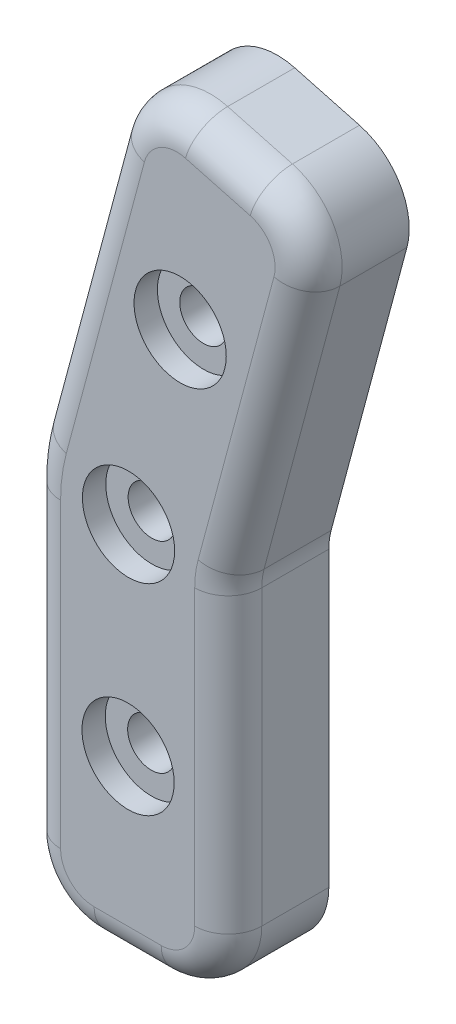
ISO-10303-21;
HEADER;
FILE_DESCRIPTION(('STEP AP214'),'2;1');
FILE_NAME('part.step','',(''),(''),'','','');
FILE_SCHEMA(('AUTOMOTIVE_DESIGN { 1 0 10303 214 1 1 1 1 }'));
ENDSEC;
DATA;
#1=APPLICATION_CONTEXT('core data for automotive mechanical design processes');
#2=APPLICATION_PROTOCOL_DEFINITION('international standard','automotive_design',2000,#1);
#3=PRODUCT_CONTEXT('',#1,'mechanical');
#4=PRODUCT('Part','Part','',(#3));
#5=PRODUCT_RELATED_PRODUCT_CATEGORY('part','',(#4));
#6=PRODUCT_DEFINITION_FORMATION('','',#4);
#7=PRODUCT_DEFINITION_CONTEXT('part definition',#1,'design');
#8=PRODUCT_DEFINITION('design','',#6,#7);
#9=PRODUCT_DEFINITION_SHAPE('','',#8);
#10=(LENGTH_UNIT() NAMED_UNIT(*) SI_UNIT(.MILLI.,.METRE.));
#11=(NAMED_UNIT(*) PLANE_ANGLE_UNIT() SI_UNIT($,.RADIAN.));
#12=(NAMED_UNIT(*) SI_UNIT($,.STERADIAN.) SOLID_ANGLE_UNIT());
#13=UNCERTAINTY_MEASURE_WITH_UNIT(LENGTH_MEASURE(1.E-05),#10,'distance_accuracy_value','');
#14=(GEOMETRIC_REPRESENTATION_CONTEXT(3) GLOBAL_UNCERTAINTY_ASSIGNED_CONTEXT((#13)) GLOBAL_UNIT_ASSIGNED_CONTEXT((#10,
#11,#12)) REPRESENTATION_CONTEXT('',''));
#15=CARTESIAN_POINT('',(0.,0.,0.));
#16=DIRECTION('',(0.,0.,1.));
#17=DIRECTION('',(1.,0.,0.));
#18=AXIS2_PLACEMENT_3D('',#15,#16,#17);
#19=CARTESIAN_POINT('',(0.0385677287744967,-0.344238019104013,4.7625));
#20=DIRECTION('',(0.,0.,1.));
#21=DIRECTION('',(1.,0.,0.));
#22=AXIS2_PLACEMENT_3D('',#19,#20,#21);
#23=CYLINDRICAL_SURFACE('',#22,2.2479);
#24=CARTESIAN_POINT('',(0.0385677287744967,-0.344238019104013,2.5527));
#25=DIRECTION('',(0.,0.,1.));
#26=DIRECTION('',(1.,0.,0.));
#27=AXIS2_PLACEMENT_3D('',#24,#25,#26);
#28=CIRCLE('',#27,2.2479);
#29=CARTESIAN_POINT('',(2.2864677287745,-0.344238019104013,2.5527));
#30=VERTEX_POINT('',#29);
#31=EDGE_CURVE('E364',#30,#30,#28,.T.);
#32=ORIENTED_EDGE('',*,*,#31,.T.);
#33=EDGE_LOOP('',(#32));
#34=FACE_BOUND('',#33,.T.);
#35=CARTESIAN_POINT('',(0.0385677287744967,-0.344238019104013,-1.5875));
#36=DIRECTION('',(0.,0.,-1.));
#37=DIRECTION('',(-1.,0.,0.));
#38=AXIS2_PLACEMENT_3D('',#35,#36,#37);
#39=CIRCLE('',#38,2.2479);
#40=CARTESIAN_POINT('',(-2.2093322712255,-0.344238019104013,-1.5875));
#41=VERTEX_POINT('',#40);
#42=EDGE_CURVE('E310',#41,#41,#39,.T.);
#43=ORIENTED_EDGE('',*,*,#42,.T.);
#44=EDGE_LOOP('',(#43));
#45=FACE_BOUND('',#44,.T.);
#46=ADVANCED_FACE('F37',(#34,#45),#23,.F.);
#47=CARTESIAN_POINT('',(4.97052059182165,37.1177107462453,4.7625));
#48=DIRECTION('',(0.,0.,1.));
#49=DIRECTION('',(1.,0.,0.));
#50=AXIS2_PLACEMENT_3D('',#47,#48,#49);
#51=CYLINDRICAL_SURFACE('',#50,2.2479);
#52=CARTESIAN_POINT('',(4.97052059182165,37.1177107462453,2.5527));
#53=DIRECTION('',(0.,0.,1.));
#54=DIRECTION('',(1.,0.,0.));
#55=AXIS2_PLACEMENT_3D('',#52,#53,#54);
#56=CIRCLE('',#55,2.2479);
#57=CARTESIAN_POINT('',(7.21842059182165,37.1177107462453,2.5527));
#58=VERTEX_POINT('',#57);
#59=EDGE_CURVE('E355',#58,#58,#56,.T.);
#60=ORIENTED_EDGE('',*,*,#59,.T.);
#61=EDGE_LOOP('',(#60));
#62=FACE_BOUND('',#61,.T.);
#63=CARTESIAN_POINT('',(4.97052059182165,37.1177107462453,-1.5875));
#64=DIRECTION('',(0.,0.,-1.));
#65=DIRECTION('',(-1.,0.,0.));
#66=AXIS2_PLACEMENT_3D('',#63,#64,#65);
#67=CIRCLE('',#66,2.2479);
#68=CARTESIAN_POINT('',(2.72262059182165,37.1177107462453,-1.5875));
#69=VERTEX_POINT('',#68);
#70=EDGE_CURVE('E328',#69,#69,#67,.T.);
#71=ORIENTED_EDGE('',*,*,#70,.T.);
#72=EDGE_LOOP('',(#71));
#73=FACE_BOUND('',#72,.T.);
#74=ADVANCED_FACE('F479',(#62,#73),#51,.F.);
#75=CARTESIAN_POINT('',(0.0814876954144572,18.705761980896,4.7625));
#76=DIRECTION('',(0.,0.,1.));
#77=DIRECTION('',(1.,0.,0.));
#78=AXIS2_PLACEMENT_3D('',#75,#76,#77);
#79=CYLINDRICAL_SURFACE('',#78,2.2479);
#80=CARTESIAN_POINT('',(0.0814876954144572,18.705761980896,2.5527));
#81=DIRECTION('',(0.,0.,1.));
#82=DIRECTION('',(1.,0.,0.));
#83=AXIS2_PLACEMENT_3D('',#80,#81,#82);
#84=CIRCLE('',#83,2.2479);
#85=CARTESIAN_POINT('',(2.32938769541446,18.705761980896,2.5527));
#86=VERTEX_POINT('',#85);
#87=EDGE_CURVE('E346',#86,#86,#84,.T.);
#88=ORIENTED_EDGE('',*,*,#87,.T.);
#89=EDGE_LOOP('',(#88));
#90=FACE_BOUND('',#89,.T.);
#91=CARTESIAN_POINT('',(0.0814876954144572,18.705761980896,-1.5875));
#92=DIRECTION('',(0.,0.,-1.));
#93=DIRECTION('',(-1.,0.,0.));
#94=AXIS2_PLACEMENT_3D('',#91,#92,#93);
#95=CIRCLE('',#94,2.2479);
#96=CARTESIAN_POINT('',(-2.16641230458554,18.705761980896,-1.5875));
#97=VERTEX_POINT('',#96);
#98=EDGE_CURVE('E330',#97,#97,#95,.T.);
#99=ORIENTED_EDGE('',*,*,#98,.T.);
#100=EDGE_LOOP('',(#99));
#101=FACE_BOUND('',#100,.T.);
#102=ADVANCED_FACE('F485',(#90,#101),#79,.F.);
#103=CARTESIAN_POINT('',(9.525,-17.4625,4.7625));
#104=DIRECTION('',(-1.,0.,0.));
#105=DIRECTION('',(0.,0.,1.));
#106=AXIS2_PLACEMENT_3D('',#103,#104,#105);
#107=PLANE('',#106);
#108=DIRECTION('',(0.,0.,-1.));
#109=VECTOR('',#108,1.);
#110=CARTESIAN_POINT('',(9.525,16.62650664032,4.7625));
#111=LINE('',#110,#109);
#112=CARTESIAN_POINT('',(9.525,16.62650664032,-4.7625));
#113=VERTEX_POINT('',#112);
#114=CARTESIAN_POINT('',(9.525,16.62650664032,1.5875));
#115=VERTEX_POINT('',#114);
#116=EDGE_CURVE('E206',#113,#115,#111,.F.);
#117=ORIENTED_EDGE('',*,*,#116,.T.);
#118=DIRECTION('',(0.,1.,0.));
#119=VECTOR('',#118,1.);
#120=CARTESIAN_POINT('',(9.525,-17.4625,1.5875));
#121=LINE('',#120,#119);
#122=CARTESIAN_POINT('',(9.525,-11.1125,1.5875));
#123=VERTEX_POINT('',#122);
#124=EDGE_CURVE('E260',#115,#123,#121,.F.);
#125=ORIENTED_EDGE('',*,*,#124,.T.);
#126=DIRECTION('',(0.,0.,-1.));
#127=VECTOR('',#126,1.);
#128=CARTESIAN_POINT('',(9.525,-11.1125,4.7625));
#129=LINE('',#128,#127);
#130=CARTESIAN_POINT('',(9.525,-11.1125,-4.7625));
#131=VERTEX_POINT('',#130);
#132=EDGE_CURVE('E204',#123,#131,#129,.T.);
#133=ORIENTED_EDGE('',*,*,#132,.T.);
#134=DIRECTION('',(0.,1.,0.));
#135=VECTOR('',#134,1.);
#136=CARTESIAN_POINT('',(9.525,-17.4625,-4.7625));
#137=LINE('',#136,#135);
#138=EDGE_CURVE('E184',#131,#113,#137,.T.);
#139=ORIENTED_EDGE('',*,*,#138,.T.);
#140=EDGE_LOOP('',(#117,#125,#133,#139));
#141=FACE_BOUND('',#140,.T.);
#142=ADVANCED_FACE('F415',(#141),#107,.F.);
#143=CARTESIAN_POINT('',(-9.525,-17.4625,4.7625));
#144=DIRECTION('',(1.,0.,0.));
#145=DIRECTION('',(0.,0.,-1.));
#146=AXIS2_PLACEMENT_3D('',#143,#144,#145);
#147=PLANE('',#146);
#148=DIRECTION('',(0.,0.,-1.));
#149=VECTOR('',#148,1.);
#150=CARTESIAN_POINT('',(-9.525,-11.1125,4.7625));
#151=LINE('',#150,#149);
#152=CARTESIAN_POINT('',(-9.525,-11.1125,-4.7625));
#153=VERTEX_POINT('',#152);
#154=CARTESIAN_POINT('',(-9.525,-11.1125,1.5875));
#155=VERTEX_POINT('',#154);
#156=EDGE_CURVE('E227',#153,#155,#151,.F.);
#157=ORIENTED_EDGE('',*,*,#156,.T.);
#158=DIRECTION('',(0.,-1.,0.));
#159=VECTOR('',#158,1.);
#160=CARTESIAN_POINT('',(-9.525,-17.4625,1.5875));
#161=LINE('',#160,#159);
#162=CARTESIAN_POINT('',(-9.525,17.4625,1.5875));
#163=VERTEX_POINT('',#162);
#164=EDGE_CURVE('E268',#155,#163,#161,.F.);
#165=ORIENTED_EDGE('',*,*,#164,.T.);
#166=DIRECTION('',(0.,0.,-1.));
#167=VECTOR('',#166,1.);
#168=CARTESIAN_POINT('',(-9.525,17.4625,4.7625));
#169=LINE('',#168,#167);
#170=CARTESIAN_POINT('',(-9.525,17.4625,-4.7625));
#171=VERTEX_POINT('',#170);
#172=EDGE_CURVE('E198',#163,#171,#169,.T.);
#173=ORIENTED_EDGE('',*,*,#172,.T.);
#174=DIRECTION('',(0.,-1.,0.));
#175=VECTOR('',#174,1.);
#176=CARTESIAN_POINT('',(-9.525,-17.4625,-4.7625));
#177=LINE('',#176,#175);
#178=EDGE_CURVE('E181',#171,#153,#177,.T.);
#179=ORIENTED_EDGE('',*,*,#178,.T.);
#180=EDGE_LOOP('',(#157,#165,#173,#179));
#181=FACE_BOUND('',#180,.T.);
#182=ADVANCED_FACE('F446',(#181),#147,.F.);
#183=CARTESIAN_POINT('',(-9.525,-17.4625,4.7625));
#184=DIRECTION('',(0.,1.,0.));
#185=DIRECTION('',(0.,0.,1.));
#186=AXIS2_PLACEMENT_3D('',#183,#184,#185);
#187=PLANE('',#186);
#188=DIRECTION('',(0.,0.,-1.));
#189=VECTOR('',#188,1.);
#190=CARTESIAN_POINT('',(3.175,-17.4625,4.7625));
#191=LINE('',#190,#189);
#192=CARTESIAN_POINT('',(3.175,-17.4625,-4.7625));
#193=VERTEX_POINT('',#192);
#194=CARTESIAN_POINT('',(3.175,-17.4625,1.5875));
#195=VERTEX_POINT('',#194);
#196=EDGE_CURVE('E222',#193,#195,#191,.F.);
#197=ORIENTED_EDGE('',*,*,#196,.T.);
#198=DIRECTION('',(1.,0.,0.));
#199=VECTOR('',#198,1.);
#200=CARTESIAN_POINT('',(-9.525,-17.4625,1.5875));
#201=LINE('',#200,#199);
#202=CARTESIAN_POINT('',(-3.175,-17.4625,1.5875));
#203=VERTEX_POINT('',#202);
#204=EDGE_CURVE('E264',#195,#203,#201,.F.);
#205=ORIENTED_EDGE('',*,*,#204,.T.);
#206=DIRECTION('',(0.,0.,-1.));
#207=VECTOR('',#206,1.);
#208=CARTESIAN_POINT('',(-3.175,-17.4625,4.7625));
#209=LINE('',#208,#207);
#210=CARTESIAN_POINT('',(-3.175,-17.4625,-4.7625));
#211=VERTEX_POINT('',#210);
#212=EDGE_CURVE('E225',#203,#211,#209,.T.);
#213=ORIENTED_EDGE('',*,*,#212,.T.);
#214=DIRECTION('',(1.,0.,0.));
#215=VECTOR('',#214,1.);
#216=CARTESIAN_POINT('',(-9.525,-17.4625,-4.7625));
#217=LINE('',#216,#215);
#218=EDGE_CURVE('E195',#211,#193,#217,.T.);
#219=ORIENTED_EDGE('',*,*,#218,.T.);
#220=EDGE_LOOP('',(#197,#205,#213,#219));
#221=FACE_BOUND('',#220,.T.);
#222=ADVANCED_FACE('F433',(#221),#187,.F.);
#223=CARTESIAN_POINT('',(0.,0.,4.7625));
#224=DIRECTION('',(0.,0.,-1.));
#225=DIRECTION('',(-1.,0.,0.));
#226=AXIS2_PLACEMENT_3D('',#223,#224,#225);
#227=PLANE('',#226);
#228=DIRECTION('',(0.,1.,0.));
#229=VECTOR('',#228,1.);
#230=CARTESIAN_POINT('',(6.35,0.,4.7625));
#231=LINE('',#230,#229);
#232=CARTESIAN_POINT('',(6.35,-11.1125,4.7625));
#233=VERTEX_POINT('',#232);
#234=CARTESIAN_POINT('',(6.35,16.62650664032,4.7625));
#235=VERTEX_POINT('',#234);
#236=EDGE_CURVE('E252',#233,#235,#231,.T.);
#237=ORIENTED_EDGE('',*,*,#236,.T.);
#238=CARTESIAN_POINT('',(15.875,16.62650664032,4.7625));
#239=DIRECTION('',(0.,0.,-1.));
#240=DIRECTION('',(-1.,0.,0.));
#241=AXIS2_PLACEMENT_3D('',#238,#239,#240);
#242=CIRCLE('',#241,9.525);
#243=CARTESIAN_POINT('',(6.67455650459663,19.0917580449215,4.7625));
#244=VERTEX_POINT('',#243);
#245=EDGE_CURVE('E254',#235,#244,#242,.T.);
#246=ORIENTED_EDGE('',*,*,#245,.T.);
#247=DIRECTION('',(0.258819045102521,0.965925826289068,0.));
#248=VECTOR('',#247,1.);
#249=CARTESIAN_POINT('',(13.8539397153368,45.8855809544106,4.7625));
#250=LINE('',#249,#248);
#251=CARTESIAN_POINT('',(13.8539397153368,45.8855809544106,4.7625));
#252=VERTEX_POINT('',#251);
#253=EDGE_CURVE('E232',#244,#252,#250,.T.);
#254=ORIENTED_EDGE('',*,*,#253,.T.);
#255=CARTESIAN_POINT('',(10.787125216869,46.7073314226111,4.7625));
#256=DIRECTION('',(0.,0.,-1.));
#257=DIRECTION('',(-1.,0.,0.));
#258=AXIS2_PLACEMENT_3D('',#255,#256,#257);
#259=CIRCLE('',#258,3.175);
#260=CARTESIAN_POINT('',(11.6088756850695,49.7741459210789,4.7625));
#261=VERTEX_POINT('',#260);
#262=EDGE_CURVE('E234',#252,#261,#259,.F.);
#263=ORIENTED_EDGE('',*,*,#262,.T.);
#264=DIRECTION('',(-0.965925826289068,0.258819045102521,0.));
#265=VECTOR('',#264,1.);
#266=CARTESIAN_POINT('',(5.47524668813389,51.4176468574799,4.7625));
#267=LINE('',#266,#265);
#268=CARTESIAN_POINT('',(5.47524668813388,51.4176468574799,4.7625));
#269=VERTEX_POINT('',#268);
#270=EDGE_CURVE('E236',#261,#269,#267,.T.);
#271=ORIENTED_EDGE('',*,*,#270,.T.);
#272=CARTESIAN_POINT('',(4.65349621993338,48.3508323590122,4.7625));
#273=DIRECTION('',(0.,0.,-1.));
#274=DIRECTION('',(-1.,0.,0.));
#275=AXIS2_PLACEMENT_3D('',#272,#273,#274);
#276=CIRCLE('',#275,3.175);
#277=CARTESIAN_POINT('',(1.58668172146559,49.1725828272127,4.7625));
#278=VERTEX_POINT('',#277);
#279=EDGE_CURVE('E238',#269,#278,#276,.F.);
#280=ORIENTED_EDGE('',*,*,#279,.T.);
#281=DIRECTION('',(-0.258819045102521,-0.965925826289068,0.));
#282=VECTOR('',#281,1.);
#283=CARTESIAN_POINT('',(-5.80907249233896,21.5712523410025,4.7625));
#284=LINE('',#283,#282);
#285=CARTESIAN_POINT('',(-5.80907249233896,21.5712523410025,4.7625));
#286=VERTEX_POINT('',#285);
#287=EDGE_CURVE('E240',#278,#286,#284,.T.);
#288=ORIENTED_EDGE('',*,*,#287,.T.);
#289=CARTESIAN_POINT('',(9.525,17.4625,4.7625));
#290=DIRECTION('',(0.,0.,-1.));
#291=DIRECTION('',(-1.,0.,0.));
#292=AXIS2_PLACEMENT_3D('',#289,#290,#291);
#293=CIRCLE('',#292,15.875);
#294=CARTESIAN_POINT('',(-6.35,17.4625,4.7625));
#295=VERTEX_POINT('',#294);
#296=EDGE_CURVE('E242',#286,#295,#293,.F.);
#297=ORIENTED_EDGE('',*,*,#296,.T.);
#298=DIRECTION('',(0.,-1.,0.));
#299=VECTOR('',#298,1.);
#300=CARTESIAN_POINT('',(-6.35,0.,4.7625));
#301=LINE('',#300,#299);
#302=CARTESIAN_POINT('',(-6.35,-11.1125,4.7625));
#303=VERTEX_POINT('',#302);
#304=EDGE_CURVE('E244',#295,#303,#301,.T.);
#305=ORIENTED_EDGE('',*,*,#304,.T.);
#306=CARTESIAN_POINT('',(-3.175,-11.1125,4.7625));
#307=DIRECTION('',(0.,0.,-1.));
#308=DIRECTION('',(-1.,0.,0.));
#309=AXIS2_PLACEMENT_3D('',#306,#307,#308);
#310=CIRCLE('',#309,3.175);
#311=CARTESIAN_POINT('',(-3.175,-14.2875,4.7625));
#312=VERTEX_POINT('',#311);
#313=EDGE_CURVE('E246',#303,#312,#310,.F.);
#314=ORIENTED_EDGE('',*,*,#313,.T.);
#315=DIRECTION('',(1.,0.,0.));
#316=VECTOR('',#315,1.);
#317=CARTESIAN_POINT('',(0.,-14.2875,4.7625));
#318=LINE('',#317,#316);
#319=CARTESIAN_POINT('',(3.175,-14.2875,4.7625));
#320=VERTEX_POINT('',#319);
#321=EDGE_CURVE('E248',#312,#320,#318,.T.);
#322=ORIENTED_EDGE('',*,*,#321,.T.);
#323=CARTESIAN_POINT('',(3.175,-11.1125,4.7625));
#324=DIRECTION('',(0.,0.,-1.));
#325=DIRECTION('',(-1.,0.,0.));
#326=AXIS2_PLACEMENT_3D('',#323,#324,#325);
#327=CIRCLE('',#326,3.175);
#328=EDGE_CURVE('E250',#320,#233,#327,.F.);
#329=ORIENTED_EDGE('',*,*,#328,.T.);
#330=EDGE_LOOP('',(#237,#246,#254,#263,#271,#280,#288,#297,#305,#314,#322,#329));
#331=FACE_BOUND('',#330,.T.);
#332=CARTESIAN_POINT('',(0.0814876954144572,18.705761980896,4.7625));
#333=DIRECTION('',(0.,0.,1.));
#334=DIRECTION('',(1.,0.,0.));
#335=AXIS2_PLACEMENT_3D('',#332,#333,#334);
#336=CIRCLE('',#335,4.36626);
#337=CARTESIAN_POINT('',(4.44774769541446,18.705761980896,4.7625));
#338=VERTEX_POINT('',#337);
#339=EDGE_CURVE('E338',#338,#338,#336,.T.);
#340=ORIENTED_EDGE('',*,*,#339,.F.);
#341=EDGE_LOOP('',(#340));
#342=FACE_BOUND('',#341,.T.);
#343=CARTESIAN_POINT('',(4.97052059182165,37.1177107462453,4.7625));
#344=DIRECTION('',(0.,0.,1.));
#345=DIRECTION('',(1.,0.,0.));
#346=AXIS2_PLACEMENT_3D('',#343,#344,#345);
#347=CIRCLE('',#346,4.36626);
#348=CARTESIAN_POINT('',(9.33678059182165,37.1177107462453,4.7625));
#349=VERTEX_POINT('',#348);
#350=EDGE_CURVE('E349',#349,#349,#347,.T.);
#351=ORIENTED_EDGE('',*,*,#350,.F.);
#352=EDGE_LOOP('',(#351));
#353=FACE_BOUND('',#352,.T.);
#354=CARTESIAN_POINT('',(0.0385677287744967,-0.344238019104013,4.7625));
#355=DIRECTION('',(0.,0.,1.));
#356=DIRECTION('',(1.,0.,0.));
#357=AXIS2_PLACEMENT_3D('',#354,#355,#356);
#358=CIRCLE('',#357,4.36626);
#359=CARTESIAN_POINT('',(4.4048277287745,-0.344238019104013,4.7625));
#360=VERTEX_POINT('',#359);
#361=EDGE_CURVE('E358',#360,#360,#358,.T.);
#362=ORIENTED_EDGE('',*,*,#361,.F.);
#363=EDGE_LOOP('',(#362));
#364=FACE_BOUND('',#363,.T.);
#365=ADVANCED_FACE('F451',(#331,#342,#353,#364),#227,.F.);
#366=CARTESIAN_POINT('',(0.,0.,-4.7625));
#367=DIRECTION('',(0.,0.,-1.));
#368=DIRECTION('',(-1.,0.,0.));
#369=AXIS2_PLACEMENT_3D('',#366,#367,#368);
#370=PLANE('',#369);
#371=CARTESIAN_POINT('',(0.0385677287744967,-0.344238019104013,-4.7625));
#372=DIRECTION('',(0.,0.,-1.));
#373=DIRECTION('',(-1.,0.,0.));
#374=AXIS2_PLACEMENT_3D('',#371,#372,#373);
#375=CIRCLE('',#374,3.175);
#376=CARTESIAN_POINT('',(-3.1364322712255,-0.344238019104013,-4.7625));
#377=VERTEX_POINT('',#376);
#378=EDGE_CURVE('E316',#377,#377,#375,.T.);
#379=ORIENTED_EDGE('',*,*,#378,.F.);
#380=EDGE_LOOP('',(#379));
#381=FACE_BOUND('',#380,.T.);
#382=CARTESIAN_POINT('',(4.97052059182165,37.1177107462453,-4.7625));
#383=DIRECTION('',(0.,0.,-1.));
#384=DIRECTION('',(-1.,0.,0.));
#385=AXIS2_PLACEMENT_3D('',#382,#383,#384);
#386=CIRCLE('',#385,3.175);
#387=CARTESIAN_POINT('',(1.79552059182165,37.1177107462453,-4.7625));
#388=VERTEX_POINT('',#387);
#389=EDGE_CURVE('E325',#388,#388,#386,.T.);
#390=ORIENTED_EDGE('',*,*,#389,.F.);
#391=EDGE_LOOP('',(#390));
#392=FACE_BOUND('',#391,.T.);
#393=CARTESIAN_POINT('',(0.0814876954144572,18.705761980896,-4.7625));
#394=DIRECTION('',(0.,0.,-1.));
#395=DIRECTION('',(-1.,0.,0.));
#396=AXIS2_PLACEMENT_3D('',#393,#394,#395);
#397=CIRCLE('',#396,3.175);
#398=CARTESIAN_POINT('',(-3.09351230458554,18.705761980896,-4.7625));
#399=VERTEX_POINT('',#398);
#400=EDGE_CURVE('E333',#399,#399,#397,.T.);
#401=ORIENTED_EDGE('',*,*,#400,.F.);
#402=EDGE_LOOP('',(#401));
#403=FACE_BOUND('',#402,.T.);
#404=DIRECTION('',(-0.258819045102521,-0.965925826289068,0.));
#405=VECTOR('',#404,1.);
#406=CARTESIAN_POINT('',(0.163368159398803,56.1279622923487,-4.7625));
#407=LINE('',#406,#405);
#408=CARTESIAN_POINT('',(-1.48013277700221,49.9943332954132,-4.7625));
#409=VERTEX_POINT('',#408);
#410=CARTESIAN_POINT('',(-8.87588699080675,22.393002809203,-4.7625));
#411=VERTEX_POINT('',#410);
#412=EDGE_CURVE('E164',#409,#411,#407,.T.);
#413=ORIENTED_EDGE('',*,*,#412,.F.);
#414=CARTESIAN_POINT('',(4.65349621993338,48.3508323590122,-4.7625));
#415=DIRECTION('',(0.,0.,-1.));
#416=DIRECTION('',(-1.,0.,0.));
#417=AXIS2_PLACEMENT_3D('',#414,#415,#416);
#418=CIRCLE('',#417,6.35);
#419=CARTESIAN_POINT('',(6.29699715633439,54.4844613559477,-4.7625));
#420=VERTEX_POINT('',#419);
#421=EDGE_CURVE('E220',#409,#420,#418,.T.);
#422=ORIENTED_EDGE('',*,*,#421,.T.);
#423=DIRECTION('',(-0.965925826289068,0.258819045102521,0.));
#424=VECTOR('',#423,1.);
#425=CARTESIAN_POINT('',(18.5642551502056,51.1974594831457,-4.7625));
#426=LINE('',#425,#424);
#427=CARTESIAN_POINT('',(12.43062615327,52.8409604195467,-4.7625));
#428=VERTEX_POINT('',#427);
#429=EDGE_CURVE('E174',#428,#420,#426,.T.);
#430=ORIENTED_EDGE('',*,*,#429,.F.);
#431=CARTESIAN_POINT('',(10.787125216869,46.7073314226111,-4.7625));
#432=DIRECTION('',(0.,0.,-1.));
#433=DIRECTION('',(-1.,0.,0.));
#434=AXIS2_PLACEMENT_3D('',#431,#432,#433);
#435=CIRCLE('',#434,6.35);
#436=CARTESIAN_POINT('',(16.9207542138046,45.0638304862101,-4.7625));
#437=VERTEX_POINT('',#436);
#438=EDGE_CURVE('E214',#428,#437,#435,.T.);
#439=ORIENTED_EDGE('',*,*,#438,.T.);
#440=DIRECTION('',(0.258819045102521,0.965925826289068,0.));
#441=VECTOR('',#440,1.);
#442=CARTESIAN_POINT('',(9.525,17.4625,-4.7625));
#443=LINE('',#442,#441);
#444=CARTESIAN_POINT('',(9.74137100306442,18.270007576721,-4.7625));
#445=VERTEX_POINT('',#444);
#446=EDGE_CURVE('E367',#445,#437,#443,.T.);
#447=ORIENTED_EDGE('',*,*,#446,.F.);
#448=CARTESIAN_POINT('',(15.875,16.62650664032,-4.7625));
#449=DIRECTION('',(0.,0.,-1.));
#450=DIRECTION('',(-1.,0.,0.));
#451=AXIS2_PLACEMENT_3D('',#448,#449,#450);
#452=CIRCLE('',#451,6.35);
#453=EDGE_CURVE('E230',#445,#113,#452,.F.);
#454=ORIENTED_EDGE('',*,*,#453,.T.);
#455=ORIENTED_EDGE('',*,*,#138,.F.);
#456=CARTESIAN_POINT('',(3.175,-11.1125,-4.7625));
#457=DIRECTION('',(0.,0.,-1.));
#458=DIRECTION('',(-1.,0.,0.));
#459=AXIS2_PLACEMENT_3D('',#456,#457,#458);
#460=CIRCLE('',#459,6.35);
#461=EDGE_CURVE('E216',#131,#193,#460,.T.);
#462=ORIENTED_EDGE('',*,*,#461,.T.);
#463=ORIENTED_EDGE('',*,*,#218,.F.);
#464=CARTESIAN_POINT('',(-3.175,-11.1125,-4.7625));
#465=DIRECTION('',(0.,0.,-1.));
#466=DIRECTION('',(-1.,0.,0.));
#467=AXIS2_PLACEMENT_3D('',#464,#465,#466);
#468=CIRCLE('',#467,6.35);
#469=EDGE_CURVE('E218',#211,#153,#468,.T.);
#470=ORIENTED_EDGE('',*,*,#469,.T.);
#471=ORIENTED_EDGE('',*,*,#178,.F.);
#472=CARTESIAN_POINT('',(9.525,17.4625,-4.7625));
#473=DIRECTION('',(0.,0.,-1.));
#474=DIRECTION('',(-1.,0.,0.));
#475=AXIS2_PLACEMENT_3D('',#472,#473,#474);
#476=CIRCLE('',#475,19.05);
#477=EDGE_CURVE('E178',#411,#171,#476,.F.);
#478=ORIENTED_EDGE('',*,*,#477,.F.);
#479=EDGE_LOOP('',(#413,#422,#430,#439,#447,#454,#455,#462,#463,#470,#471,#478));
#480=FACE_BOUND('',#479,.T.);
#481=ADVANCED_FACE('F179',(#381,#392,#403,#480),#370,.T.);
#482=CARTESIAN_POINT('',(9.525,17.4625,-24.4402122133534));
#483=DIRECTION('',(0.,0.,1.));
#484=DIRECTION('',(1.,0.,0.));
#485=AXIS2_PLACEMENT_3D('',#482,#483,#484);
#486=CYLINDRICAL_SURFACE('',#485,19.05);
#487=ORIENTED_EDGE('',*,*,#172,.F.);
#488=CARTESIAN_POINT('',(9.525,17.4625,1.5875));
#489=DIRECTION('',(0.,0.,-1.));
#490=DIRECTION('',(-1.,0.,0.));
#491=AXIS2_PLACEMENT_3D('',#488,#489,#490);
#492=CIRCLE('',#491,19.05);
#493=CARTESIAN_POINT('',(-8.87588699080675,22.393002809203,1.5875));
#494=VERTEX_POINT('',#493);
#495=EDGE_CURVE('E188',#163,#494,#492,.T.);
#496=ORIENTED_EDGE('',*,*,#495,.T.);
#497=DIRECTION('',(0.,0.,1.));
#498=VECTOR('',#497,1.);
#499=CARTESIAN_POINT('',(-8.87588699080675,22.393002809203,-24.4402122133534));
#500=LINE('',#499,#498);
#501=EDGE_CURVE('E168',#411,#494,#500,.T.);
#502=ORIENTED_EDGE('',*,*,#501,.F.);
#503=ORIENTED_EDGE('',*,*,#477,.T.);
#504=EDGE_LOOP('',(#487,#496,#502,#503));
#505=FACE_BOUND('',#504,.T.);
#506=ADVANCED_FACE('F186',(#505),#486,.T.);
#507=CARTESIAN_POINT('',(9.525,17.4625,-52.1753608607412));
#508=DIRECTION('',(0.965925826289068,-0.258819045102521,0.));
#509=DIRECTION('',(0.258819045102521,0.965925826289068,0.));
#510=AXIS2_PLACEMENT_3D('',#507,#508,#509);
#511=PLANE('',#510);
#512=DIRECTION('',(0.,0.,1.));
#513=VECTOR('',#512,1.);
#514=CARTESIAN_POINT('',(16.9207542138046,45.0638304862101,-52.1753608607412));
#515=LINE('',#514,#513);
#516=CARTESIAN_POINT('',(16.9207542138046,45.0638304862101,1.5875));
#517=VERTEX_POINT('',#516);
#518=EDGE_CURVE('E200',#437,#517,#515,.T.);
#519=ORIENTED_EDGE('',*,*,#518,.T.);
#520=DIRECTION('',(0.258819045102521,0.965925826289068,0.));
#521=VECTOR('',#520,1.);
#522=CARTESIAN_POINT('',(9.74137100306442,18.270007576721,1.5875));
#523=LINE('',#522,#521);
#524=CARTESIAN_POINT('',(9.74137100306442,18.270007576721,1.5875));
#525=VERTEX_POINT('',#524);
#526=EDGE_CURVE('E11',#517,#525,#523,.F.);
#527=ORIENTED_EDGE('',*,*,#526,.T.);
#528=DIRECTION('',(0.,0.,-1.));
#529=VECTOR('',#528,1.);
#530=CARTESIAN_POINT('',(9.74137100306442,18.270007576721,-52.1753608607412));
#531=LINE('',#530,#529);
#532=EDGE_CURVE('E202',#525,#445,#531,.T.);
#533=ORIENTED_EDGE('',*,*,#532,.T.);
#534=ORIENTED_EDGE('',*,*,#446,.T.);
#535=EDGE_LOOP('',(#519,#527,#533,#534));
#536=FACE_BOUND('',#535,.T.);
#537=ADVANCED_FACE('F397',(#536),#511,.T.);
#538=CARTESIAN_POINT('',(18.5642551502056,51.1974594831457,-52.1753608607412));
#539=DIRECTION('',(0.258819045102521,0.965925826289068,0.));
#540=DIRECTION('',(-0.965925826289068,0.258819045102521,0.));
#541=AXIS2_PLACEMENT_3D('',#538,#539,#540);
#542=PLANE('',#541);
#543=DIRECTION('',(0.,0.,1.));
#544=VECTOR('',#543,1.);
#545=CARTESIAN_POINT('',(6.29699715633439,54.4844613559477,-52.1753608607412));
#546=LINE('',#545,#544);
#547=CARTESIAN_POINT('',(6.29699715633439,54.4844613559477,1.5875));
#548=VERTEX_POINT('',#547);
#549=EDGE_CURVE('E211',#420,#548,#546,.T.);
#550=ORIENTED_EDGE('',*,*,#549,.T.);
#551=DIRECTION('',(-0.965925826289068,0.258819045102521,0.));
#552=VECTOR('',#551,1.);
#553=CARTESIAN_POINT('',(12.43062615327,52.8409604195467,1.5875));
#554=LINE('',#553,#552);
#555=CARTESIAN_POINT('',(12.43062615327,52.8409604195467,1.5875));
#556=VERTEX_POINT('',#555);
#557=EDGE_CURVE('E61',#548,#556,#554,.F.);
#558=ORIENTED_EDGE('',*,*,#557,.T.);
#559=DIRECTION('',(0.,0.,1.));
#560=VECTOR('',#559,1.);
#561=CARTESIAN_POINT('',(12.43062615327,52.8409604195467,-52.1753608607412));
#562=LINE('',#561,#560);
#563=EDGE_CURVE('E209',#556,#428,#562,.F.);
#564=ORIENTED_EDGE('',*,*,#563,.T.);
#565=ORIENTED_EDGE('',*,*,#429,.T.);
#566=EDGE_LOOP('',(#550,#558,#564,#565));
#567=FACE_BOUND('',#566,.T.);
#568=ADVANCED_FACE('F372',(#567),#542,.T.);
#569=CARTESIAN_POINT('',(0.163368159398803,56.1279622923487,-52.1753608607412));
#570=DIRECTION('',(-0.965925826289068,0.258819045102521,0.));
#571=DIRECTION('',(-0.258819045102521,-0.965925826289068,0.));
#572=AXIS2_PLACEMENT_3D('',#569,#570,#571);
#573=PLANE('',#572);
#574=ORIENTED_EDGE('',*,*,#501,.T.);
#575=DIRECTION('',(-0.258819045102521,-0.965925826289068,0.));
#576=VECTOR('',#575,1.);
#577=CARTESIAN_POINT('',(-1.4801327770022,49.9943332954132,1.5875));
#578=LINE('',#577,#576);
#579=CARTESIAN_POINT('',(-1.4801327770022,49.9943332954132,1.5875));
#580=VERTEX_POINT('',#579);
#581=EDGE_CURVE('E271',#494,#580,#578,.F.);
#582=ORIENTED_EDGE('',*,*,#581,.T.);
#583=DIRECTION('',(0.,0.,1.));
#584=VECTOR('',#583,1.);
#585=CARTESIAN_POINT('',(-1.4801327770022,49.9943332954132,-52.1753608607412));
#586=LINE('',#585,#584);
#587=EDGE_CURVE('E171',#580,#409,#586,.F.);
#588=ORIENTED_EDGE('',*,*,#587,.T.);
#589=ORIENTED_EDGE('',*,*,#412,.T.);
#590=EDGE_LOOP('',(#574,#582,#588,#589));
#591=FACE_BOUND('',#590,.T.);
#592=ADVANCED_FACE('F166',(#591),#573,.T.);
#593=CARTESIAN_POINT('',(2.2864677287745,-0.344238019104013,2.5527));
#594=DIRECTION('',(0.,0.,-1.));
#595=DIRECTION('',(-1.,0.,0.));
#596=AXIS2_PLACEMENT_3D('',#593,#594,#595);
#597=PLANE('',#596);
#598=ORIENTED_EDGE('',*,*,#31,.F.);
#599=EDGE_LOOP('',(#598));
#600=FACE_BOUND('',#599,.T.);
#601=CARTESIAN_POINT('',(0.0385677287744967,-0.344238019104013,2.5527));
#602=DIRECTION('',(0.,0.,1.));
#603=DIRECTION('',(1.,0.,0.));
#604=AXIS2_PLACEMENT_3D('',#601,#602,#603);
#605=CIRCLE('',#604,4.36626);
#606=CARTESIAN_POINT('',(4.4048277287745,-0.344238019104013,2.5527));
#607=VERTEX_POINT('',#606);
#608=EDGE_CURVE('E361',#607,#607,#605,.T.);
#609=ORIENTED_EDGE('',*,*,#608,.T.);
#610=EDGE_LOOP('',(#609));
#611=FACE_BOUND('',#610,.T.);
#612=ADVANCED_FACE('F464',(#600,#611),#597,.F.);
#613=CARTESIAN_POINT('',(0.0385677287744967,-0.344238019104013,4.7625));
#614=DIRECTION('',(0.,0.,1.));
#615=DIRECTION('',(1.,0.,0.));
#616=AXIS2_PLACEMENT_3D('',#613,#614,#615);
#617=CYLINDRICAL_SURFACE('',#616,4.36626);
#618=ORIENTED_EDGE('',*,*,#608,.F.);
#619=EDGE_LOOP('',(#618));
#620=FACE_BOUND('',#619,.T.);
#621=ORIENTED_EDGE('',*,*,#361,.T.);
#622=EDGE_LOOP('',(#621));
#623=FACE_BOUND('',#622,.T.);
#624=ADVANCED_FACE('F461',(#620,#623),#617,.F.);
#625=CARTESIAN_POINT('',(7.21842059182165,37.1177107462453,2.5527));
#626=DIRECTION('',(0.,0.,-1.));
#627=DIRECTION('',(-1.,0.,0.));
#628=AXIS2_PLACEMENT_3D('',#625,#626,#627);
#629=PLANE('',#628);
#630=ORIENTED_EDGE('',*,*,#59,.F.);
#631=EDGE_LOOP('',(#630));
#632=FACE_BOUND('',#631,.T.);
#633=CARTESIAN_POINT('',(4.97052059182165,37.1177107462453,2.5527));
#634=DIRECTION('',(0.,0.,1.));
#635=DIRECTION('',(1.,0.,0.));
#636=AXIS2_PLACEMENT_3D('',#633,#634,#635);
#637=CIRCLE('',#636,4.36626);
#638=CARTESIAN_POINT('',(9.33678059182165,37.1177107462453,2.5527));
#639=VERTEX_POINT('',#638);
#640=EDGE_CURVE('E352',#639,#639,#637,.T.);
#641=ORIENTED_EDGE('',*,*,#640,.T.);
#642=EDGE_LOOP('',(#641));
#643=FACE_BOUND('',#642,.T.);
#644=ADVANCED_FACE('F463',(#632,#643),#629,.F.);
#645=CARTESIAN_POINT('',(4.97052059182165,37.1177107462453,4.7625));
#646=DIRECTION('',(0.,0.,1.));
#647=DIRECTION('',(1.,0.,0.));
#648=AXIS2_PLACEMENT_3D('',#645,#646,#647);
#649=CYLINDRICAL_SURFACE('',#648,4.36626);
#650=ORIENTED_EDGE('',*,*,#640,.F.);
#651=EDGE_LOOP('',(#650));
#652=FACE_BOUND('',#651,.T.);
#653=ORIENTED_EDGE('',*,*,#350,.T.);
#654=EDGE_LOOP('',(#653));
#655=FACE_BOUND('',#654,.T.);
#656=ADVANCED_FACE('F471',(#652,#655),#649,.F.);
#657=CARTESIAN_POINT('',(2.32938769541446,18.705761980896,2.5527));
#658=DIRECTION('',(0.,0.,-1.));
#659=DIRECTION('',(-1.,0.,0.));
#660=AXIS2_PLACEMENT_3D('',#657,#658,#659);
#661=PLANE('',#660);
#662=ORIENTED_EDGE('',*,*,#87,.F.);
#663=EDGE_LOOP('',(#662));
#664=FACE_BOUND('',#663,.T.);
#665=CARTESIAN_POINT('',(0.0814876954144572,18.705761980896,2.5527));
#666=DIRECTION('',(0.,0.,1.));
#667=DIRECTION('',(1.,0.,0.));
#668=AXIS2_PLACEMENT_3D('',#665,#666,#667);
#669=CIRCLE('',#668,4.36626);
#670=CARTESIAN_POINT('',(4.44774769541446,18.705761980896,2.5527));
#671=VERTEX_POINT('',#670);
#672=EDGE_CURVE('E343',#671,#671,#669,.T.);
#673=ORIENTED_EDGE('',*,*,#672,.T.);
#674=EDGE_LOOP('',(#673));
#675=FACE_BOUND('',#674,.T.);
#676=ADVANCED_FACE('F568',(#664,#675),#661,.F.);
#677=CARTESIAN_POINT('',(0.0814876954144572,18.705761980896,4.7625));
#678=DIRECTION('',(0.,0.,1.));
#679=DIRECTION('',(1.,0.,0.));
#680=AXIS2_PLACEMENT_3D('',#677,#678,#679);
#681=CYLINDRICAL_SURFACE('',#680,4.36626);
#682=ORIENTED_EDGE('',*,*,#672,.F.);
#683=EDGE_LOOP('',(#682));
#684=FACE_BOUND('',#683,.T.);
#685=ORIENTED_EDGE('',*,*,#339,.T.);
#686=EDGE_LOOP('',(#685));
#687=FACE_BOUND('',#686,.T.);
#688=ADVANCED_FACE('F507',(#684,#687),#681,.F.);
#689=CARTESIAN_POINT('',(15.875,16.62650664032,-52.1753608607412));
#690=DIRECTION('',(0.,0.,-1.));
#691=DIRECTION('',(-1.,0.,0.));
#692=AXIS2_PLACEMENT_3D('',#689,#690,#691);
#693=CYLINDRICAL_SURFACE('',#692,6.35);
#694=ORIENTED_EDGE('',*,*,#532,.F.);
#695=CARTESIAN_POINT('',(15.875,16.62650664032,1.5875));
#696=DIRECTION('',(0.,0.,-1.));
#697=DIRECTION('',(-1.,0.,0.));
#698=AXIS2_PLACEMENT_3D('',#695,#696,#697);
#699=CIRCLE('',#698,6.35);
#700=EDGE_CURVE('E257',#525,#115,#699,.F.);
#701=ORIENTED_EDGE('',*,*,#700,.T.);
#702=ORIENTED_EDGE('',*,*,#116,.F.);
#703=ORIENTED_EDGE('',*,*,#453,.F.);
#704=EDGE_LOOP('',(#694,#701,#702,#703));
#705=FACE_BOUND('',#704,.T.);
#706=ADVANCED_FACE('F401',(#705),#693,.F.);
#707=CARTESIAN_POINT('',(4.65349621993338,48.3508323590122,-52.1753608607412));
#708=DIRECTION('',(0.,0.,1.));
#709=DIRECTION('',(1.,0.,0.));
#710=AXIS2_PLACEMENT_3D('',#707,#708,#709);
#711=CYLINDRICAL_SURFACE('',#710,6.35);
#712=ORIENTED_EDGE('',*,*,#587,.F.);
#713=CARTESIAN_POINT('',(4.65349621993338,48.3508323590122,1.5875));
#714=DIRECTION('',(0.,0.,-1.));
#715=DIRECTION('',(-1.,0.,0.));
#716=AXIS2_PLACEMENT_3D('',#713,#714,#715);
#717=CIRCLE('',#716,6.35);
#718=EDGE_CURVE('E273',#580,#548,#717,.T.);
#719=ORIENTED_EDGE('',*,*,#718,.T.);
#720=ORIENTED_EDGE('',*,*,#549,.F.);
#721=ORIENTED_EDGE('',*,*,#421,.F.);
#722=EDGE_LOOP('',(#712,#719,#720,#721));
#723=FACE_BOUND('',#722,.T.);
#724=ADVANCED_FACE('F376',(#723),#711,.T.);
#725=CARTESIAN_POINT('',(-3.175,-11.1125,4.7625));
#726=DIRECTION('',(0.,0.,-1.));
#727=DIRECTION('',(-1.,0.,0.));
#728=AXIS2_PLACEMENT_3D('',#725,#726,#727);
#729=CYLINDRICAL_SURFACE('',#728,6.35);
#730=ORIENTED_EDGE('',*,*,#212,.F.);
#731=CARTESIAN_POINT('',(-3.175,-11.1125,1.5875));
#732=DIRECTION('',(0.,0.,-1.));
#733=DIRECTION('',(-1.,0.,0.));
#734=AXIS2_PLACEMENT_3D('',#731,#732,#733);
#735=CIRCLE('',#734,6.35);
#736=EDGE_CURVE('E266',#203,#155,#735,.T.);
#737=ORIENTED_EDGE('',*,*,#736,.T.);
#738=ORIENTED_EDGE('',*,*,#156,.F.);
#739=ORIENTED_EDGE('',*,*,#469,.F.);
#740=EDGE_LOOP('',(#730,#737,#738,#739));
#741=FACE_BOUND('',#740,.T.);
#742=ADVANCED_FACE('F437',(#741),#729,.T.);
#743=CARTESIAN_POINT('',(3.175,-11.1125,4.7625));
#744=DIRECTION('',(0.,0.,-1.));
#745=DIRECTION('',(-1.,0.,0.));
#746=AXIS2_PLACEMENT_3D('',#743,#744,#745);
#747=CYLINDRICAL_SURFACE('',#746,6.35);
#748=ORIENTED_EDGE('',*,*,#132,.F.);
#749=CARTESIAN_POINT('',(3.175,-11.1125,1.5875));
#750=DIRECTION('',(0.,0.,-1.));
#751=DIRECTION('',(-1.,0.,0.));
#752=AXIS2_PLACEMENT_3D('',#749,#750,#751);
#753=CIRCLE('',#752,6.35);
#754=EDGE_CURVE('E262',#123,#195,#753,.T.);
#755=ORIENTED_EDGE('',*,*,#754,.T.);
#756=ORIENTED_EDGE('',*,*,#196,.F.);
#757=ORIENTED_EDGE('',*,*,#461,.F.);
#758=EDGE_LOOP('',(#748,#755,#756,#757));
#759=FACE_BOUND('',#758,.T.);
#760=ADVANCED_FACE('F419',(#759),#747,.T.);
#761=CARTESIAN_POINT('',(10.787125216869,46.7073314226111,-52.1753608607412));
#762=DIRECTION('',(0.,0.,1.));
#763=DIRECTION('',(1.,0.,0.));
#764=AXIS2_PLACEMENT_3D('',#761,#762,#763);
#765=CYLINDRICAL_SURFACE('',#764,6.35);
#766=ORIENTED_EDGE('',*,*,#563,.F.);
#767=CARTESIAN_POINT('',(10.787125216869,46.7073314226111,1.5875));
#768=DIRECTION('',(0.,0.,-1.));
#769=DIRECTION('',(-1.,0.,0.));
#770=AXIS2_PLACEMENT_3D('',#767,#768,#769);
#771=CIRCLE('',#770,6.35);
#772=EDGE_CURVE('E46',#556,#517,#771,.T.);
#773=ORIENTED_EDGE('',*,*,#772,.T.);
#774=ORIENTED_EDGE('',*,*,#518,.F.);
#775=ORIENTED_EDGE('',*,*,#438,.F.);
#776=EDGE_LOOP('',(#766,#773,#774,#775));
#777=FACE_BOUND('',#776,.T.);
#778=ADVANCED_FACE('F514',(#777),#765,.T.);
#779=CARTESIAN_POINT('',(0.0814876954144572,18.705761980896,-1.5875));
#780=DIRECTION('',(0.,0.,-1.));
#781=DIRECTION('',(-1.,0.,0.));
#782=AXIS2_PLACEMENT_3D('',#779,#780,#781);
#783=CYLINDRICAL_SURFACE('',#782,3.175);
#784=CARTESIAN_POINT('',(0.0814876954144572,18.705761980896,-1.5875));
#785=DIRECTION('',(0.,0.,-1.));
#786=DIRECTION('',(-1.,0.,0.));
#787=AXIS2_PLACEMENT_3D('',#784,#785,#786);
#788=CIRCLE('',#787,3.175);
#789=CARTESIAN_POINT('',(-3.09351230458554,18.705761980896,-1.5875));
#790=VERTEX_POINT('',#789);
#791=EDGE_CURVE('E335',#790,#790,#788,.T.);
#792=ORIENTED_EDGE('',*,*,#791,.F.);
#793=EDGE_LOOP('',(#792));
#794=FACE_BOUND('',#793,.T.);
#795=ORIENTED_EDGE('',*,*,#400,.T.);
#796=EDGE_LOOP('',(#795));
#797=FACE_BOUND('',#796,.T.);
#798=ADVANCED_FACE('F517',(#794,#797),#783,.F.);
#799=CARTESIAN_POINT('',(0.0814876954144572,18.705761980896,-1.5875));
#800=DIRECTION('',(0.,0.,-1.));
#801=DIRECTION('',(-1.,0.,0.));
#802=AXIS2_PLACEMENT_3D('',#799,#800,#801);
#803=PLANE('',#802);
#804=ORIENTED_EDGE('',*,*,#98,.F.);
#805=EDGE_LOOP('',(#804));
#806=FACE_BOUND('',#805,.T.);
#807=ORIENTED_EDGE('',*,*,#791,.T.);
#808=EDGE_LOOP('',(#807));
#809=FACE_BOUND('',#808,.T.);
#810=ADVANCED_FACE('F559',(#806,#809),#803,.T.);
#811=CARTESIAN_POINT('',(4.97052059182165,37.1177107462453,-1.5875));
#812=DIRECTION('',(0.,0.,-1.));
#813=DIRECTION('',(-1.,0.,0.));
#814=AXIS2_PLACEMENT_3D('',#811,#812,#813);
#815=CYLINDRICAL_SURFACE('',#814,3.175);
#816=CARTESIAN_POINT('',(4.97052059182165,37.1177107462453,-1.5875));
#817=DIRECTION('',(0.,0.,-1.));
#818=DIRECTION('',(-1.,0.,0.));
#819=AXIS2_PLACEMENT_3D('',#816,#817,#818);
#820=CIRCLE('',#819,3.175);
#821=CARTESIAN_POINT('',(1.79552059182165,37.1177107462453,-1.5875));
#822=VERTEX_POINT('',#821);
#823=EDGE_CURVE('E334',#822,#822,#820,.T.);
#824=ORIENTED_EDGE('',*,*,#823,.F.);
#825=EDGE_LOOP('',(#824));
#826=FACE_BOUND('',#825,.T.);
#827=ORIENTED_EDGE('',*,*,#389,.T.);
#828=EDGE_LOOP('',(#827));
#829=FACE_BOUND('',#828,.T.);
#830=ADVANCED_FACE('F556',(#826,#829),#815,.F.);
#831=CARTESIAN_POINT('',(4.97052059182165,37.1177107462453,-1.5875));
#832=DIRECTION('',(0.,0.,-1.));
#833=DIRECTION('',(-1.,0.,0.));
#834=AXIS2_PLACEMENT_3D('',#831,#832,#833);
#835=PLANE('',#834);
#836=ORIENTED_EDGE('',*,*,#70,.F.);
#837=EDGE_LOOP('',(#836));
#838=FACE_BOUND('',#837,.T.);
#839=ORIENTED_EDGE('',*,*,#823,.T.);
#840=EDGE_LOOP('',(#839));
#841=FACE_BOUND('',#840,.T.);
#842=ADVANCED_FACE('F551',(#838,#841),#835,.T.);
#843=CARTESIAN_POINT('',(0.0385677287744967,-0.344238019104013,-1.5875));
#844=DIRECTION('',(0.,0.,-1.));
#845=DIRECTION('',(-1.,0.,0.));
#846=AXIS2_PLACEMENT_3D('',#843,#844,#845);
#847=CYLINDRICAL_SURFACE('',#846,3.175);
#848=CARTESIAN_POINT('',(0.0385677287744967,-0.344238019104013,-1.5875));
#849=DIRECTION('',(0.,0.,-1.));
#850=DIRECTION('',(-1.,0.,0.));
#851=AXIS2_PLACEMENT_3D('',#848,#849,#850);
#852=CIRCLE('',#851,3.175);
#853=CARTESIAN_POINT('',(-3.1364322712255,-0.344238019104013,-1.5875));
#854=VERTEX_POINT('',#853);
#855=EDGE_CURVE('E321',#854,#854,#852,.T.);
#856=ORIENTED_EDGE('',*,*,#855,.F.);
#857=EDGE_LOOP('',(#856));
#858=FACE_BOUND('',#857,.T.);
#859=ORIENTED_EDGE('',*,*,#378,.T.);
#860=EDGE_LOOP('',(#859));
#861=FACE_BOUND('',#860,.T.);
#862=ADVANCED_FACE('F545',(#858,#861),#847,.F.);
#863=CARTESIAN_POINT('',(0.0385677287744967,-0.344238019104013,-1.5875));
#864=DIRECTION('',(0.,0.,-1.));
#865=DIRECTION('',(-1.,0.,0.));
#866=AXIS2_PLACEMENT_3D('',#863,#864,#865);
#867=PLANE('',#866);
#868=ORIENTED_EDGE('',*,*,#42,.F.);
#869=EDGE_LOOP('',(#868));
#870=FACE_BOUND('',#869,.T.);
#871=ORIENTED_EDGE('',*,*,#855,.T.);
#872=EDGE_LOOP('',(#871));
#873=FACE_BOUND('',#872,.T.);
#874=ADVANCED_FACE('F541',(#870,#873),#867,.T.);
#875=CARTESIAN_POINT('',(9.525,17.4625,1.5875));
#876=DIRECTION('',(0.,0.,-1.));
#877=DIRECTION('',(-1.,0.,0.));
#878=AXIS2_PLACEMENT_3D('',#875,#876,#877);
#879=TOROIDAL_SURFACE('',#878,15.875,3.175);
#880=CARTESIAN_POINT('',(-5.80907249233896,21.5712523410025,1.5875));
#881=DIRECTION('',(0.258819045102521,0.965925826289068,0.));
#882=DIRECTION('',(-0.965925826289068,0.258819045102521,0.));
#883=AXIS2_PLACEMENT_3D('',#880,#881,#882);
#884=CIRCLE('',#883,3.175);
#885=EDGE_CURVE('E304',#494,#286,#884,.T.);
#886=ORIENTED_EDGE('',*,*,#885,.F.);
#887=ORIENTED_EDGE('',*,*,#495,.F.);
#888=CARTESIAN_POINT('',(-6.35,17.4625,1.5875));
#889=DIRECTION('',(0.,-1.,0.));
#890=DIRECTION('',(0.,0.,-1.));
#891=AXIS2_PLACEMENT_3D('',#888,#889,#890);
#892=CIRCLE('',#891,3.175);
#893=EDGE_CURVE('E41',#295,#163,#892,.T.);
#894=ORIENTED_EDGE('',*,*,#893,.F.);
#895=ORIENTED_EDGE('',*,*,#296,.F.);
#896=EDGE_LOOP('',(#886,#887,#894,#895));
#897=FACE_BOUND('',#896,.T.);
#898=ADVANCED_FACE('F39',(#897),#879,.T.);
#899=CARTESIAN_POINT('',(-6.35,0.,1.5875));
#900=DIRECTION('',(0.,-1.,0.));
#901=DIRECTION('',(0.,0.,-1.));
#902=AXIS2_PLACEMENT_3D('',#899,#900,#901);
#903=CYLINDRICAL_SURFACE('',#902,3.175);
#904=ORIENTED_EDGE('',*,*,#893,.T.);
#905=ORIENTED_EDGE('',*,*,#164,.F.);
#906=CARTESIAN_POINT('',(-6.35,-11.1125,1.5875));
#907=DIRECTION('',(0.,-1.,0.));
#908=DIRECTION('',(0.,0.,-1.));
#909=AXIS2_PLACEMENT_3D('',#906,#907,#908);
#910=CIRCLE('',#909,3.175);
#911=EDGE_CURVE('E302',#303,#155,#910,.T.);
#912=ORIENTED_EDGE('',*,*,#911,.F.);
#913=ORIENTED_EDGE('',*,*,#304,.F.);
#914=EDGE_LOOP('',(#904,#905,#912,#913));
#915=FACE_BOUND('',#914,.T.);
#916=ADVANCED_FACE('F444',(#915),#903,.T.);
#917=CARTESIAN_POINT('',(-10.8127515068156,2.89726803420964,1.5875));
#918=DIRECTION('',(0.258819045102521,0.965925826289068,0.));
#919=DIRECTION('',(-0.965925826289068,0.258819045102521,0.));
#920=AXIS2_PLACEMENT_3D('',#917,#918,#919);
#921=CYLINDRICAL_SURFACE('',#920,3.175);
#922=ORIENTED_EDGE('',*,*,#885,.T.);
#923=ORIENTED_EDGE('',*,*,#287,.F.);
#924=CARTESIAN_POINT('',(1.58668172146559,49.1725828272127,1.5875));
#925=DIRECTION('',(0.25881904510252,0.965925826289068,0.));
#926=DIRECTION('',(-0.965925826289068,0.25881904510252,0.));
#927=AXIS2_PLACEMENT_3D('',#924,#925,#926);
#928=CIRCLE('',#927,3.175);
#929=EDGE_CURVE('E299',#580,#278,#928,.T.);
#930=ORIENTED_EDGE('',*,*,#929,.F.);
#931=ORIENTED_EDGE('',*,*,#581,.F.);
#932=EDGE_LOOP('',(#922,#923,#930,#931));
#933=FACE_BOUND('',#932,.T.);
#934=ADVANCED_FACE('F449',(#933),#921,.T.);
#935=CARTESIAN_POINT('',(-3.175,-11.1125,1.5875));
#936=DIRECTION('',(0.,0.,-1.));
#937=DIRECTION('',(-1.,0.,0.));
#938=AXIS2_PLACEMENT_3D('',#935,#936,#937);
#939=DEGENERATE_TOROIDAL_SURFACE('',#938,3.175,3.175,.T.);
#940=ORIENTED_EDGE('',*,*,#911,.T.);
#941=ORIENTED_EDGE('',*,*,#736,.F.);
#942=CARTESIAN_POINT('',(-3.175,-14.2875,1.5875));
#943=DIRECTION('',(1.,0.,0.));
#944=DIRECTION('',(0.,0.,-1.));
#945=AXIS2_PLACEMENT_3D('',#942,#943,#944);
#946=CIRCLE('',#945,3.175);
#947=EDGE_CURVE('E296',#312,#203,#946,.T.);
#948=ORIENTED_EDGE('',*,*,#947,.F.);
#949=ORIENTED_EDGE('',*,*,#313,.F.);
#950=EDGE_LOOP('',(#940,#941,#948,#949));
#951=FACE_BOUND('',#950,.T.);
#952=ADVANCED_FACE('F441',(#951),#939,.T.);
#953=CARTESIAN_POINT('',(4.65349621993338,48.3508323590122,1.5875));
#954=DIRECTION('',(0.,0.,-1.));
#955=DIRECTION('',(-1.,0.,0.));
#956=AXIS2_PLACEMENT_3D('',#953,#954,#955);
#957=DEGENERATE_TOROIDAL_SURFACE('',#956,3.175,3.175,.T.);
#958=ORIENTED_EDGE('',*,*,#929,.T.);
#959=ORIENTED_EDGE('',*,*,#279,.F.);
#960=CARTESIAN_POINT('',(5.47524668813389,51.4176468574799,1.5875));
#961=DIRECTION('',(0.965925826289068,-0.258819045102521,0.));
#962=DIRECTION('',(0.258819045102521,0.965925826289068,0.));
#963=AXIS2_PLACEMENT_3D('',#960,#961,#962);
#964=CIRCLE('',#963,3.175);
#965=EDGE_CURVE('E293',#548,#269,#964,.T.);
#966=ORIENTED_EDGE('',*,*,#965,.F.);
#967=ORIENTED_EDGE('',*,*,#718,.F.);
#968=EDGE_LOOP('',(#958,#959,#966,#967));
#969=FACE_BOUND('',#968,.T.);
#970=ADVANCED_FACE('F380',(#969),#957,.T.);
#971=CARTESIAN_POINT('',(0.,-14.2875,1.5875));
#972=DIRECTION('',(1.,0.,0.));
#973=DIRECTION('',(0.,0.,-1.));
#974=AXIS2_PLACEMENT_3D('',#971,#972,#973);
#975=CYLINDRICAL_SURFACE('',#974,3.175);
#976=ORIENTED_EDGE('',*,*,#947,.T.);
#977=ORIENTED_EDGE('',*,*,#204,.F.);
#978=CARTESIAN_POINT('',(3.175,-14.2875,1.5875));
#979=DIRECTION('',(1.,0.,0.));
#980=DIRECTION('',(0.,1.,0.));
#981=AXIS2_PLACEMENT_3D('',#978,#979,#980);
#982=CIRCLE('',#981,3.175);
#983=EDGE_CURVE('E290',#320,#195,#982,.T.);
#984=ORIENTED_EDGE('',*,*,#983,.F.);
#985=ORIENTED_EDGE('',*,*,#321,.F.);
#986=EDGE_LOOP('',(#976,#977,#984,#985));
#987=FACE_BOUND('',#986,.T.);
#988=ADVANCED_FACE('F429',(#987),#975,.T.);
#989=CARTESIAN_POINT('',(13.2211836964817,49.3421292914708,1.5875));
#990=DIRECTION('',(0.965925826289068,-0.258819045102521,0.));
#991=DIRECTION('',(0.258819045102521,0.965925826289068,0.));
#992=AXIS2_PLACEMENT_3D('',#989,#990,#991);
#993=CYLINDRICAL_SURFACE('',#992,3.175);
#994=ORIENTED_EDGE('',*,*,#965,.T.);
#995=ORIENTED_EDGE('',*,*,#270,.F.);
#996=CARTESIAN_POINT('',(11.6088756850695,49.7741459210789,1.5875));
#997=DIRECTION('',(0.965925826289068,-0.258819045102522,0.));
#998=DIRECTION('',(0.258819045102522,0.965925826289068,0.));
#999=AXIS2_PLACEMENT_3D('',#996,#997,#998);
#1000=CIRCLE('',#999,3.175);
#1001=EDGE_CURVE('E287',#556,#261,#1000,.T.);
#1002=ORIENTED_EDGE('',*,*,#1001,.F.);
#1003=ORIENTED_EDGE('',*,*,#557,.F.);
#1004=EDGE_LOOP('',(#994,#995,#1002,#1003));
#1005=FACE_BOUND('',#1004,.T.);
#1006=ADVANCED_FACE('F385',(#1005),#993,.T.);
#1007=CARTESIAN_POINT('',(3.175,-11.1125,1.5875));
#1008=DIRECTION('',(0.,0.,-1.));
#1009=DIRECTION('',(-1.,0.,0.));
#1010=AXIS2_PLACEMENT_3D('',#1007,#1008,#1009);
#1011=DEGENERATE_TOROIDAL_SURFACE('',#1010,3.175,3.175,.T.);
#1012=ORIENTED_EDGE('',*,*,#983,.T.);
#1013=ORIENTED_EDGE('',*,*,#754,.F.);
#1014=CARTESIAN_POINT('',(6.35,-11.1125,1.5875));
#1015=DIRECTION('',(0.,1.,0.));
#1016=DIRECTION('',(0.,0.,1.));
#1017=AXIS2_PLACEMENT_3D('',#1014,#1015,#1016);
#1018=CIRCLE('',#1017,3.175);
#1019=EDGE_CURVE('E284',#233,#123,#1018,.T.);
#1020=ORIENTED_EDGE('',*,*,#1019,.F.);
#1021=ORIENTED_EDGE('',*,*,#328,.F.);
#1022=EDGE_LOOP('',(#1012,#1013,#1020,#1021));
#1023=FACE_BOUND('',#1022,.T.);
#1024=ADVANCED_FACE('F423',(#1023),#1011,.T.);
#1025=CARTESIAN_POINT('',(10.787125216869,46.7073314226111,1.5875));
#1026=DIRECTION('',(0.,0.,-1.));
#1027=DIRECTION('',(-1.,0.,0.));
#1028=AXIS2_PLACEMENT_3D('',#1025,#1026,#1027);
#1029=DEGENERATE_TOROIDAL_SURFACE('',#1028,3.175,3.175,.T.);
#1030=ORIENTED_EDGE('',*,*,#1001,.T.);
#1031=ORIENTED_EDGE('',*,*,#262,.F.);
#1032=CARTESIAN_POINT('',(13.8539397153368,45.8855809544106,1.5875));
#1033=DIRECTION('',(-0.258819045102521,-0.965925826289068,0.));
#1034=DIRECTION('',(0.965925826289068,-0.258819045102521,0.));
#1035=AXIS2_PLACEMENT_3D('',#1032,#1033,#1034);
#1036=CIRCLE('',#1035,3.175);
#1037=EDGE_CURVE('E281',#517,#252,#1036,.T.);
#1038=ORIENTED_EDGE('',*,*,#1037,.F.);
#1039=ORIENTED_EDGE('',*,*,#772,.F.);
#1040=EDGE_LOOP('',(#1030,#1031,#1038,#1039));
#1041=FACE_BOUND('',#1040,.T.);
#1042=ADVANCED_FACE('F389',(#1041),#1029,.T.);
#1043=CARTESIAN_POINT('',(6.35,0.,1.5875));
#1044=DIRECTION('',(0.,1.,0.));
#1045=DIRECTION('',(0.,0.,1.));
#1046=AXIS2_PLACEMENT_3D('',#1043,#1044,#1045);
#1047=CYLINDRICAL_SURFACE('',#1046,3.175);
#1048=ORIENTED_EDGE('',*,*,#1019,.T.);
#1049=ORIENTED_EDGE('',*,*,#124,.F.);
#1050=CARTESIAN_POINT('',(6.35,16.62650664032,1.5875));
#1051=DIRECTION('',(0.,1.,0.));
#1052=DIRECTION('',(-1.,0.,0.));
#1053=AXIS2_PLACEMENT_3D('',#1050,#1051,#1052);
#1054=CIRCLE('',#1053,3.175);
#1055=EDGE_CURVE('E279',#235,#115,#1054,.T.);
#1056=ORIENTED_EDGE('',*,*,#1055,.F.);
#1057=ORIENTED_EDGE('',*,*,#236,.F.);
#1058=EDGE_LOOP('',(#1048,#1049,#1056,#1057));
#1059=FACE_BOUND('',#1058,.T.);
#1060=ADVANCED_FACE('F411',(#1059),#1047,.T.);
#1061=CARTESIAN_POINT('',(1.45450648705559,-0.389733838592376,1.5875));
#1062=DIRECTION('',(-0.258819045102521,-0.965925826289068,0.));
#1063=DIRECTION('',(0.965925826289068,-0.258819045102521,0.));
#1064=AXIS2_PLACEMENT_3D('',#1061,#1062,#1063);
#1065=CYLINDRICAL_SURFACE('',#1064,3.175);
#1066=ORIENTED_EDGE('',*,*,#1037,.T.);
#1067=ORIENTED_EDGE('',*,*,#253,.F.);
#1068=CARTESIAN_POINT('',(6.67455650459663,19.0917580449215,1.5875));
#1069=DIRECTION('',(-0.258819045102521,-0.965925826289068,0.));
#1070=DIRECTION('',(0.965925826289068,-0.258819045102522,0.));
#1071=AXIS2_PLACEMENT_3D('',#1068,#1069,#1070);
#1072=CIRCLE('',#1071,3.175);
#1073=EDGE_CURVE('E277',#525,#244,#1072,.T.);
#1074=ORIENTED_EDGE('',*,*,#1073,.F.);
#1075=ORIENTED_EDGE('',*,*,#526,.F.);
#1076=EDGE_LOOP('',(#1066,#1067,#1074,#1075));
#1077=FACE_BOUND('',#1076,.T.);
#1078=ADVANCED_FACE('F394',(#1077),#1065,.T.);
#1079=CARTESIAN_POINT('',(15.875,16.62650664032,1.5875));
#1080=DIRECTION('',(0.,0.,-1.));
#1081=DIRECTION('',(-1.,0.,0.));
#1082=AXIS2_PLACEMENT_3D('',#1079,#1080,#1081);
#1083=TOROIDAL_SURFACE('',#1082,9.525,3.175);
#1084=ORIENTED_EDGE('',*,*,#1055,.T.);
#1085=ORIENTED_EDGE('',*,*,#700,.F.);
#1086=ORIENTED_EDGE('',*,*,#1073,.T.);
#1087=ORIENTED_EDGE('',*,*,#245,.F.);
#1088=EDGE_LOOP('',(#1084,#1085,#1086,#1087));
#1089=FACE_BOUND('',#1088,.T.);
#1090=ADVANCED_FACE('F405',(#1089),#1083,.T.);
#1091=CLOSED_SHELL('',(#46,#74,#102,#142,#182,#222,#365,#481,#506,#537,#568,#592,#612,#624,#644,
#656,#676,#688,#706,#724,#742,#760,#778,#798,#810,#830,#842,#862,#874,#898,#916,#934,#952,#970,
#988,#1006,#1024,#1042,#1060,#1078,#1090));
#1092=MANIFOLD_SOLID_BREP('B2',#1091);
#1093=ADVANCED_BREP_SHAPE_REPRESENTATION('',(#18,#1092),#14);
#1094=SHAPE_DEFINITION_REPRESENTATION(#9,#1093);
ENDSEC;
END-ISO-10303-21;
